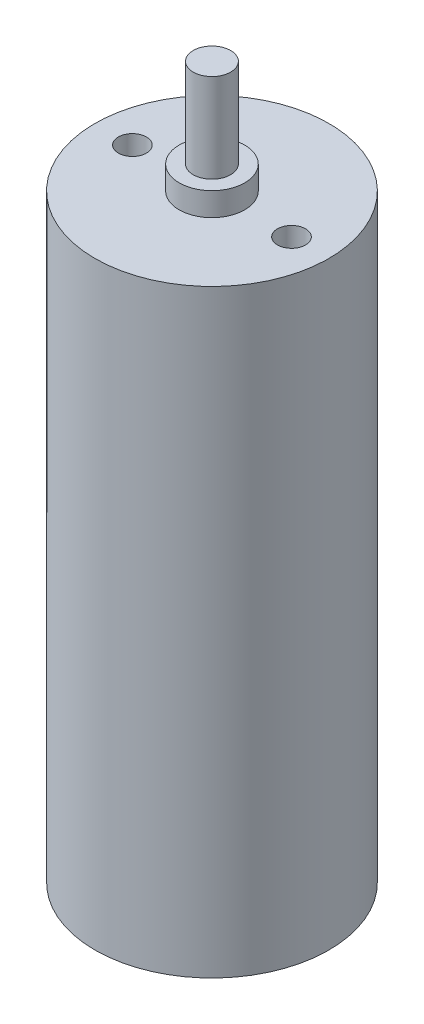
ISO-10303-21;
HEADER;
FILE_DESCRIPTION(('STEP AP214'),'2;1');
FILE_NAME('part.step','',(''),(''),'','','');
FILE_SCHEMA(('AUTOMOTIVE_DESIGN { 1 0 10303 214 1 1 1 1 }'));
ENDSEC;
DATA;
#1=APPLICATION_CONTEXT('core data for automotive mechanical design processes');
#2=APPLICATION_PROTOCOL_DEFINITION('international standard','automotive_design',2000,#1);
#3=PRODUCT_CONTEXT('',#1,'mechanical');
#4=PRODUCT('Part','Part','',(#3));
#5=PRODUCT_RELATED_PRODUCT_CATEGORY('part','',(#4));
#6=PRODUCT_DEFINITION_FORMATION('','',#4);
#7=PRODUCT_DEFINITION_CONTEXT('part definition',#1,'design');
#8=PRODUCT_DEFINITION('design','',#6,#7);
#9=PRODUCT_DEFINITION_SHAPE('','',#8);
#10=(LENGTH_UNIT() NAMED_UNIT(*) SI_UNIT(.MILLI.,.METRE.));
#11=(NAMED_UNIT(*) PLANE_ANGLE_UNIT() SI_UNIT($,.RADIAN.));
#12=(NAMED_UNIT(*) SI_UNIT($,.STERADIAN.) SOLID_ANGLE_UNIT());
#13=UNCERTAINTY_MEASURE_WITH_UNIT(LENGTH_MEASURE(1.E-05),#10,'distance_accuracy_value','');
#14=(GEOMETRIC_REPRESENTATION_CONTEXT(3) GLOBAL_UNCERTAINTY_ASSIGNED_CONTEXT((#13)) GLOBAL_UNIT_ASSIGNED_CONTEXT((#10,
#11,#12)) REPRESENTATION_CONTEXT('',''));
#15=CARTESIAN_POINT('',(0.,0.,0.));
#16=DIRECTION('',(0.,0.,1.));
#17=DIRECTION('',(1.,0.,0.));
#18=AXIS2_PLACEMENT_3D('',#15,#16,#17);
#19=CARTESIAN_POINT('',(0.,64.,0.));
#20=DIRECTION('',(0.,-1.,0.));
#21=DIRECTION('',(0.,0.,-1.));
#22=AXIS2_PLACEMENT_3D('',#19,#20,#21);
#23=CYLINDRICAL_SURFACE('',#22,12.5);
#24=CARTESIAN_POINT('',(0.,64.,0.));
#25=DIRECTION('',(0.,1.,0.));
#26=DIRECTION('',(0.,0.,1.));
#27=AXIS2_PLACEMENT_3D('',#24,#25,#26);
#28=CIRCLE('',#27,12.5);
#29=CARTESIAN_POINT('',(0.,64.,12.5));
#30=VERTEX_POINT('',#29);
#31=EDGE_CURVE('E46',#30,#30,#28,.T.);
#32=ORIENTED_EDGE('',*,*,#31,.F.);
#33=EDGE_LOOP('',(#32));
#34=FACE_BOUND('',#33,.T.);
#35=CARTESIAN_POINT('',(0.,0.,0.));
#36=DIRECTION('',(0.,1.,0.));
#37=DIRECTION('',(0.,0.,1.));
#38=AXIS2_PLACEMENT_3D('',#35,#36,#37);
#39=CIRCLE('',#38,12.5);
#40=CARTESIAN_POINT('',(0.,0.,12.5));
#41=VERTEX_POINT('',#40);
#42=EDGE_CURVE('E42',#41,#41,#39,.T.);
#43=ORIENTED_EDGE('',*,*,#42,.T.);
#44=EDGE_LOOP('',(#43));
#45=FACE_BOUND('',#44,.T.);
#46=ADVANCED_FACE('F39',(#34,#45),#23,.T.);
#47=CARTESIAN_POINT('',(0.,64.,0.));
#48=DIRECTION('',(0.,1.,0.));
#49=DIRECTION('',(0.,0.,1.));
#50=AXIS2_PLACEMENT_3D('',#47,#48,#49);
#51=PLANE('',#50);
#52=CARTESIAN_POINT('',(0.,64.,0.));
#53=DIRECTION('',(0.,1.,0.));
#54=DIRECTION('',(0.,0.,1.));
#55=AXIS2_PLACEMENT_3D('',#52,#53,#54);
#56=CIRCLE('',#55,3.5);
#57=CARTESIAN_POINT('',(0.,64.,3.5));
#58=VERTEX_POINT('',#57);
#59=EDGE_CURVE('E58',#58,#58,#56,.T.);
#60=ORIENTED_EDGE('',*,*,#59,.F.);
#61=EDGE_LOOP('',(#60));
#62=FACE_BOUND('',#61,.T.);
#63=CARTESIAN_POINT('',(8.5,64.,0.));
#64=DIRECTION('',(0.,1.,0.));
#65=DIRECTION('',(0.,0.,1.));
#66=AXIS2_PLACEMENT_3D('',#63,#64,#65);
#67=CIRCLE('',#66,1.5);
#68=CARTESIAN_POINT('',(8.5,64.,1.5));
#69=VERTEX_POINT('',#68);
#70=EDGE_CURVE('E64',#69,#69,#67,.T.);
#71=ORIENTED_EDGE('',*,*,#70,.F.);
#72=EDGE_LOOP('',(#71));
#73=FACE_BOUND('',#72,.T.);
#74=CARTESIAN_POINT('',(-8.5,64.,0.));
#75=DIRECTION('',(0.,1.,0.));
#76=DIRECTION('',(0.,0.,1.));
#77=AXIS2_PLACEMENT_3D('',#74,#75,#76);
#78=CIRCLE('',#77,1.5);
#79=CARTESIAN_POINT('',(-8.5,64.,1.5));
#80=VERTEX_POINT('',#79);
#81=EDGE_CURVE('E57',#80,#80,#78,.T.);
#82=ORIENTED_EDGE('',*,*,#81,.F.);
#83=EDGE_LOOP('',(#82));
#84=FACE_BOUND('',#83,.T.);
#85=ORIENTED_EDGE('',*,*,#31,.T.);
#86=EDGE_LOOP('',(#85));
#87=FACE_BOUND('',#86,.T.);
#88=ADVANCED_FACE('F75',(#62,#73,#84,#87),#51,.T.);
#89=CARTESIAN_POINT('',(0.,0.,0.));
#90=DIRECTION('',(0.,1.,0.));
#91=DIRECTION('',(0.,0.,1.));
#92=AXIS2_PLACEMENT_3D('',#89,#90,#91);
#93=PLANE('',#92);
#94=ORIENTED_EDGE('',*,*,#42,.F.);
#95=EDGE_LOOP('',(#94));
#96=FACE_BOUND('',#95,.T.);
#97=ADVANCED_FACE('F78',(#96),#93,.F.);
#98=CARTESIAN_POINT('',(-8.5,24.,0.));
#99=DIRECTION('',(0.,1.,0.));
#100=DIRECTION('',(0.,0.,1.));
#101=AXIS2_PLACEMENT_3D('',#98,#99,#100);
#102=CYLINDRICAL_SURFACE('',#101,1.5);
#103=CARTESIAN_POINT('',(-8.5,24.,0.));
#104=DIRECTION('',(0.,1.,0.));
#105=DIRECTION('',(0.,0.,1.));
#106=AXIS2_PLACEMENT_3D('',#103,#104,#105);
#107=CIRCLE('',#106,1.5);
#108=CARTESIAN_POINT('',(-8.5,24.,1.5));
#109=VERTEX_POINT('',#108);
#110=EDGE_CURVE('E67',#109,#109,#107,.T.);
#111=ORIENTED_EDGE('',*,*,#110,.F.);
#112=EDGE_LOOP('',(#111));
#113=FACE_BOUND('',#112,.T.);
#114=ORIENTED_EDGE('',*,*,#81,.T.);
#115=EDGE_LOOP('',(#114));
#116=FACE_BOUND('',#115,.T.);
#117=ADVANCED_FACE('F73',(#113,#116),#102,.F.);
#118=CARTESIAN_POINT('',(0.,24.,0.));
#119=DIRECTION('',(0.,1.,0.));
#120=DIRECTION('',(0.,0.,1.));
#121=AXIS2_PLACEMENT_3D('',#118,#119,#120);
#122=PLANE('',#121);
#123=ORIENTED_EDGE('',*,*,#110,.T.);
#124=EDGE_LOOP('',(#123));
#125=FACE_BOUND('',#124,.T.);
#126=ADVANCED_FACE('F92',(#125),#122,.T.);
#127=CARTESIAN_POINT('',(8.5,24.,0.));
#128=DIRECTION('',(0.,1.,0.));
#129=DIRECTION('',(0.,0.,1.));
#130=AXIS2_PLACEMENT_3D('',#127,#128,#129);
#131=CYLINDRICAL_SURFACE('',#130,1.5);
#132=CARTESIAN_POINT('',(8.5,24.,0.));
#133=DIRECTION('',(0.,1.,0.));
#134=DIRECTION('',(0.,0.,1.));
#135=AXIS2_PLACEMENT_3D('',#132,#133,#134);
#136=CIRCLE('',#135,1.5);
#137=CARTESIAN_POINT('',(8.5,24.,1.5));
#138=VERTEX_POINT('',#137);
#139=EDGE_CURVE('E61',#138,#138,#136,.T.);
#140=ORIENTED_EDGE('',*,*,#139,.F.);
#141=EDGE_LOOP('',(#140));
#142=FACE_BOUND('',#141,.T.);
#143=ORIENTED_EDGE('',*,*,#70,.T.);
#144=EDGE_LOOP('',(#143));
#145=FACE_BOUND('',#144,.T.);
#146=ADVANCED_FACE('F98',(#142,#145),#131,.F.);
#147=CARTESIAN_POINT('',(0.,24.,0.));
#148=DIRECTION('',(0.,1.,0.));
#149=DIRECTION('',(0.,0.,1.));
#150=AXIS2_PLACEMENT_3D('',#147,#148,#149);
#151=PLANE('',#150);
#152=ORIENTED_EDGE('',*,*,#139,.T.);
#153=EDGE_LOOP('',(#152));
#154=FACE_BOUND('',#153,.T.);
#155=ADVANCED_FACE('F102',(#154),#151,.T.);
#156=CARTESIAN_POINT('',(0.,66.5,0.));
#157=DIRECTION('',(0.,-1.,0.));
#158=DIRECTION('',(0.,0.,-1.));
#159=AXIS2_PLACEMENT_3D('',#156,#157,#158);
#160=CYLINDRICAL_SURFACE('',#159,3.5);
#161=CARTESIAN_POINT('',(0.,66.5,0.));
#162=DIRECTION('',(0.,1.,0.));
#163=DIRECTION('',(0.,0.,1.));
#164=AXIS2_PLACEMENT_3D('',#161,#162,#163);
#165=CIRCLE('',#164,3.5);
#166=CARTESIAN_POINT('',(0.,66.5,3.5));
#167=VERTEX_POINT('',#166);
#168=EDGE_CURVE('E54',#167,#167,#165,.T.);
#169=ORIENTED_EDGE('',*,*,#168,.F.);
#170=EDGE_LOOP('',(#169));
#171=FACE_BOUND('',#170,.T.);
#172=ORIENTED_EDGE('',*,*,#59,.T.);
#173=EDGE_LOOP('',(#172));
#174=FACE_BOUND('',#173,.T.);
#175=ADVANCED_FACE('F106',(#171,#174),#160,.T.);
#176=CARTESIAN_POINT('',(0.,66.5,0.));
#177=DIRECTION('',(0.,1.,0.));
#178=DIRECTION('',(0.,0.,1.));
#179=AXIS2_PLACEMENT_3D('',#176,#177,#178);
#180=PLANE('',#179);
#181=CARTESIAN_POINT('',(0.,66.5,0.));
#182=DIRECTION('',(0.,1.,0.));
#183=DIRECTION('',(0.,0.,1.));
#184=AXIS2_PLACEMENT_3D('',#181,#182,#183);
#185=CIRCLE('',#184,2.);
#186=CARTESIAN_POINT('',(0.,66.5,2.));
#187=VERTEX_POINT('',#186);
#188=EDGE_CURVE('E10',#187,#187,#185,.T.);
#189=ORIENTED_EDGE('',*,*,#188,.F.);
#190=EDGE_LOOP('',(#189));
#191=FACE_BOUND('',#190,.T.);
#192=ORIENTED_EDGE('',*,*,#168,.T.);
#193=EDGE_LOOP('',(#192));
#194=FACE_BOUND('',#193,.T.);
#195=ADVANCED_FACE('F110',(#191,#194),#180,.T.);
#196=CARTESIAN_POINT('',(0.,76.,0.));
#197=DIRECTION('',(0.,-1.,0.));
#198=DIRECTION('',(0.,0.,-1.));
#199=AXIS2_PLACEMENT_3D('',#196,#197,#198);
#200=CYLINDRICAL_SURFACE('',#199,2.);
#201=CARTESIAN_POINT('',(0.,76.,0.));
#202=DIRECTION('',(0.,1.,0.));
#203=DIRECTION('',(0.,0.,1.));
#204=AXIS2_PLACEMENT_3D('',#201,#202,#203);
#205=CIRCLE('',#204,2.);
#206=CARTESIAN_POINT('',(0.,76.,2.));
#207=VERTEX_POINT('',#206);
#208=EDGE_CURVE('E53',#207,#207,#205,.T.);
#209=ORIENTED_EDGE('',*,*,#208,.F.);
#210=EDGE_LOOP('',(#209));
#211=FACE_BOUND('',#210,.T.);
#212=ORIENTED_EDGE('',*,*,#188,.T.);
#213=EDGE_LOOP('',(#212));
#214=FACE_BOUND('',#213,.T.);
#215=ADVANCED_FACE('F114',(#211,#214),#200,.T.);
#216=CARTESIAN_POINT('',(0.,76.,0.));
#217=DIRECTION('',(0.,1.,0.));
#218=DIRECTION('',(0.,0.,1.));
#219=AXIS2_PLACEMENT_3D('',#216,#217,#218);
#220=PLANE('',#219);
#221=ORIENTED_EDGE('',*,*,#208,.T.);
#222=EDGE_LOOP('',(#221));
#223=FACE_BOUND('',#222,.T.);
#224=ADVANCED_FACE('F118',(#223),#220,.T.);
#225=CLOSED_SHELL('',(#46,#88,#97,#117,#126,#146,#155,#175,#195,#215,#224));
#226=MANIFOLD_SOLID_BREP('B2',#225);
#227=ADVANCED_BREP_SHAPE_REPRESENTATION('',(#18,#226),#14);
#228=SHAPE_DEFINITION_REPRESENTATION(#9,#227);
ENDSEC;
END-ISO-10303-21;
